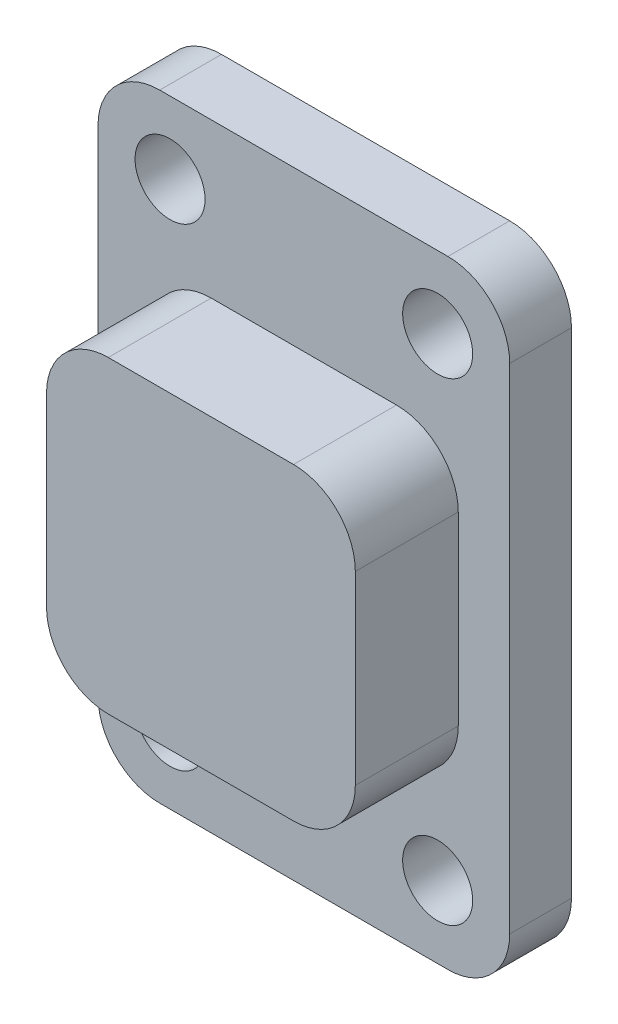
ISO-10303-21;
HEADER;
FILE_DESCRIPTION(('STEP AP214'),'2;1');
FILE_NAME('part.step','',(''),(''),'','','');
FILE_SCHEMA(('AUTOMOTIVE_DESIGN { 1 0 10303 214 1 1 1 1 }'));
ENDSEC;
DATA;
#1=APPLICATION_CONTEXT('core data for automotive mechanical design processes');
#2=APPLICATION_PROTOCOL_DEFINITION('international standard','automotive_design',2000,#1);
#3=PRODUCT_CONTEXT('',#1,'mechanical');
#4=PRODUCT('Part','Part','',(#3));
#5=PRODUCT_RELATED_PRODUCT_CATEGORY('part','',(#4));
#6=PRODUCT_DEFINITION_FORMATION('','',#4);
#7=PRODUCT_DEFINITION_CONTEXT('part definition',#1,'design');
#8=PRODUCT_DEFINITION('design','',#6,#7);
#9=PRODUCT_DEFINITION_SHAPE('','',#8);
#10=(LENGTH_UNIT() NAMED_UNIT(*) SI_UNIT(.MILLI.,.METRE.));
#11=(NAMED_UNIT(*) PLANE_ANGLE_UNIT() SI_UNIT($,.RADIAN.));
#12=(NAMED_UNIT(*) SI_UNIT($,.STERADIAN.) SOLID_ANGLE_UNIT());
#13=UNCERTAINTY_MEASURE_WITH_UNIT(LENGTH_MEASURE(1.E-05),#10,'distance_accuracy_value','');
#14=(GEOMETRIC_REPRESENTATION_CONTEXT(3) GLOBAL_UNCERTAINTY_ASSIGNED_CONTEXT((#13)) GLOBAL_UNIT_ASSIGNED_CONTEXT((#10,
#11,#12)) REPRESENTATION_CONTEXT('',''));
#15=CARTESIAN_POINT('',(0.,0.,0.));
#16=DIRECTION('',(0.,0.,1.));
#17=DIRECTION('',(1.,0.,0.));
#18=AXIS2_PLACEMENT_3D('',#15,#16,#17);
#19=CARTESIAN_POINT('',(0.,0.,3.));
#20=DIRECTION('',(0.,0.,-1.));
#21=DIRECTION('',(-1.,0.,0.));
#22=AXIS2_PLACEMENT_3D('',#19,#20,#21);
#23=PLANE('',#22);
#24=CARTESIAN_POINT('',(-6.5,11.5,3.));
#25=DIRECTION('',(0.,0.,1.));
#26=DIRECTION('',(1.,0.,0.));
#27=AXIS2_PLACEMENT_3D('',#24,#25,#26);
#28=CIRCLE('',#27,1.7);
#29=CARTESIAN_POINT('',(-4.8,11.5,3.));
#30=VERTEX_POINT('',#29);
#31=EDGE_CURVE('E284',#30,#30,#28,.T.);
#32=ORIENTED_EDGE('',*,*,#31,.F.);
#33=EDGE_LOOP('',(#32));
#34=FACE_BOUND('',#33,.T.);
#35=CARTESIAN_POINT('',(6.5,11.5,3.));
#36=DIRECTION('',(0.,0.,1.));
#37=DIRECTION('',(1.,0.,0.));
#38=AXIS2_PLACEMENT_3D('',#35,#36,#37);
#39=CIRCLE('',#38,1.7);
#40=CARTESIAN_POINT('',(8.2,11.5,3.));
#41=VERTEX_POINT('',#40);
#42=EDGE_CURVE('E290',#41,#41,#39,.T.);
#43=ORIENTED_EDGE('',*,*,#42,.F.);
#44=EDGE_LOOP('',(#43));
#45=FACE_BOUND('',#44,.T.);
#46=CARTESIAN_POINT('',(6.5,-11.5,3.));
#47=DIRECTION('',(0.,0.,1.));
#48=DIRECTION('',(1.,0.,0.));
#49=AXIS2_PLACEMENT_3D('',#46,#47,#48);
#50=CIRCLE('',#49,1.7);
#51=CARTESIAN_POINT('',(8.2,-11.5,3.));
#52=VERTEX_POINT('',#51);
#53=EDGE_CURVE('E296',#52,#52,#50,.T.);
#54=ORIENTED_EDGE('',*,*,#53,.F.);
#55=EDGE_LOOP('',(#54));
#56=FACE_BOUND('',#55,.T.);
#57=DIRECTION('',(0.,-1.,0.));
#58=VECTOR('',#57,1.);
#59=CARTESIAN_POINT('',(-10.,-15.,3.));
#60=LINE('',#59,#58);
#61=CARTESIAN_POINT('',(-10.,12.,3.));
#62=VERTEX_POINT('',#61);
#63=CARTESIAN_POINT('',(-10.,-12.,3.));
#64=VERTEX_POINT('',#63);
#65=EDGE_CURVE('E311',#62,#64,#60,.T.);
#66=ORIENTED_EDGE('',*,*,#65,.T.);
#67=CARTESIAN_POINT('',(-7.,-12.,3.));
#68=DIRECTION('',(0.,0.,-1.));
#69=DIRECTION('',(-1.,0.,0.));
#70=AXIS2_PLACEMENT_3D('',#67,#68,#69);
#71=CIRCLE('',#70,3.);
#72=CARTESIAN_POINT('',(-7.,-15.,3.));
#73=VERTEX_POINT('',#72);
#74=EDGE_CURVE('E198',#64,#73,#71,.F.);
#75=ORIENTED_EDGE('',*,*,#74,.T.);
#76=DIRECTION('',(1.,0.,0.));
#77=VECTOR('',#76,1.);
#78=CARTESIAN_POINT('',(-10.,-15.,3.));
#79=LINE('',#78,#77);
#80=CARTESIAN_POINT('',(7.,-15.,3.));
#81=VERTEX_POINT('',#80);
#82=EDGE_CURVE('E167',#73,#81,#79,.T.);
#83=ORIENTED_EDGE('',*,*,#82,.T.);
#84=CARTESIAN_POINT('',(7.,-12.,3.));
#85=DIRECTION('',(0.,0.,-1.));
#86=DIRECTION('',(-1.,0.,0.));
#87=AXIS2_PLACEMENT_3D('',#84,#85,#86);
#88=CIRCLE('',#87,3.);
#89=CARTESIAN_POINT('',(10.,-12.,3.));
#90=VERTEX_POINT('',#89);
#91=EDGE_CURVE('E196',#81,#90,#88,.F.);
#92=ORIENTED_EDGE('',*,*,#91,.T.);
#93=DIRECTION('',(0.,1.,0.));
#94=VECTOR('',#93,1.);
#95=CARTESIAN_POINT('',(10.,-15.,3.));
#96=LINE('',#95,#94);
#97=CARTESIAN_POINT('',(10.,12.,3.));
#98=VERTEX_POINT('',#97);
#99=EDGE_CURVE('E174',#90,#98,#96,.T.);
#100=ORIENTED_EDGE('',*,*,#99,.T.);
#101=CARTESIAN_POINT('',(7.,12.,3.));
#102=DIRECTION('',(0.,0.,-1.));
#103=DIRECTION('',(-1.,0.,0.));
#104=AXIS2_PLACEMENT_3D('',#101,#102,#103);
#105=CIRCLE('',#104,3.);
#106=CARTESIAN_POINT('',(7.,15.,3.));
#107=VERTEX_POINT('',#106);
#108=EDGE_CURVE('E194',#98,#107,#105,.F.);
#109=ORIENTED_EDGE('',*,*,#108,.T.);
#110=DIRECTION('',(-1.,0.,0.));
#111=VECTOR('',#110,1.);
#112=CARTESIAN_POINT('',(-10.,15.,3.));
#113=LINE('',#112,#111);
#114=CARTESIAN_POINT('',(-7.,15.,3.));
#115=VERTEX_POINT('',#114);
#116=EDGE_CURVE('E178',#107,#115,#113,.T.);
#117=ORIENTED_EDGE('',*,*,#116,.T.);
#118=CARTESIAN_POINT('',(-7.,12.,3.));
#119=DIRECTION('',(0.,0.,-1.));
#120=DIRECTION('',(-1.,0.,0.));
#121=AXIS2_PLACEMENT_3D('',#118,#119,#120);
#122=CIRCLE('',#121,3.);
#123=EDGE_CURVE('E192',#115,#62,#122,.F.);
#124=ORIENTED_EDGE('',*,*,#123,.T.);
#125=EDGE_LOOP('',(#66,#75,#83,#92,#100,#109,#117,#124));
#126=FACE_BOUND('',#125,.T.);
#127=CARTESIAN_POINT('',(-6.5,-11.5,3.));
#128=DIRECTION('',(0.,0.,1.));
#129=DIRECTION('',(1.,0.,0.));
#130=AXIS2_PLACEMENT_3D('',#127,#128,#129);
#131=CIRCLE('',#130,1.7);
#132=CARTESIAN_POINT('',(-4.8,-11.5,3.));
#133=VERTEX_POINT('',#132);
#134=EDGE_CURVE('E302',#133,#133,#131,.T.);
#135=ORIENTED_EDGE('',*,*,#134,.F.);
#136=EDGE_LOOP('',(#135));
#137=FACE_BOUND('',#136,.T.);
#138=DIRECTION('',(-1.,0.,0.));
#139=VECTOR('',#138,1.);
#140=CARTESIAN_POINT('',(7.5,7.5,3.));
#141=LINE('',#140,#139);
#142=CARTESIAN_POINT('',(4.5,7.5,3.));
#143=VERTEX_POINT('',#142);
#144=CARTESIAN_POINT('',(-4.5,7.5,3.));
#145=VERTEX_POINT('',#144);
#146=EDGE_CURVE('E242',#143,#145,#141,.T.);
#147=ORIENTED_EDGE('',*,*,#146,.F.);
#148=CARTESIAN_POINT('',(4.5,4.5,3.));
#149=DIRECTION('',(0.,0.,-1.));
#150=DIRECTION('',(-1.,0.,0.));
#151=AXIS2_PLACEMENT_3D('',#148,#149,#150);
#152=CIRCLE('',#151,3.);
#153=CARTESIAN_POINT('',(7.5,4.5,3.));
#154=VERTEX_POINT('',#153);
#155=EDGE_CURVE('E239',#143,#154,#152,.T.);
#156=ORIENTED_EDGE('',*,*,#155,.T.);
#157=DIRECTION('',(0.,1.,0.));
#158=VECTOR('',#157,1.);
#159=CARTESIAN_POINT('',(7.5,-7.5,3.));
#160=LINE('',#159,#158);
#161=CARTESIAN_POINT('',(7.5,-4.5,3.));
#162=VERTEX_POINT('',#161);
#163=EDGE_CURVE('E250',#162,#154,#160,.T.);
#164=ORIENTED_EDGE('',*,*,#163,.F.);
#165=CARTESIAN_POINT('',(4.5,-4.5,3.));
#166=DIRECTION('',(0.,0.,-1.));
#167=DIRECTION('',(-1.,0.,0.));
#168=AXIS2_PLACEMENT_3D('',#165,#166,#167);
#169=CIRCLE('',#168,3.);
#170=CARTESIAN_POINT('',(4.5,-7.5,3.));
#171=VERTEX_POINT('',#170);
#172=EDGE_CURVE('E237',#162,#171,#169,.T.);
#173=ORIENTED_EDGE('',*,*,#172,.T.);
#174=DIRECTION('',(1.,0.,0.));
#175=VECTOR('',#174,1.);
#176=CARTESIAN_POINT('',(7.5,-7.5,3.));
#177=LINE('',#176,#175);
#178=CARTESIAN_POINT('',(-4.5,-7.5,3.));
#179=VERTEX_POINT('',#178);
#180=EDGE_CURVE('E276',#179,#171,#177,.T.);
#181=ORIENTED_EDGE('',*,*,#180,.F.);
#182=CARTESIAN_POINT('',(-4.5,-4.5,3.));
#183=DIRECTION('',(0.,0.,-1.));
#184=DIRECTION('',(-1.,0.,0.));
#185=AXIS2_PLACEMENT_3D('',#182,#183,#184);
#186=CIRCLE('',#185,3.);
#187=CARTESIAN_POINT('',(-7.5,-4.5,3.));
#188=VERTEX_POINT('',#187);
#189=EDGE_CURVE('E12',#179,#188,#186,.T.);
#190=ORIENTED_EDGE('',*,*,#189,.T.);
#191=DIRECTION('',(0.,-1.,0.));
#192=VECTOR('',#191,1.);
#193=CARTESIAN_POINT('',(-7.5,-7.5,3.));
#194=LINE('',#193,#192);
#195=CARTESIAN_POINT('',(-7.5,4.5,3.));
#196=VERTEX_POINT('',#195);
#197=EDGE_CURVE('E243',#196,#188,#194,.T.);
#198=ORIENTED_EDGE('',*,*,#197,.F.);
#199=CARTESIAN_POINT('',(-4.5,4.5,3.));
#200=DIRECTION('',(0.,0.,-1.));
#201=DIRECTION('',(-1.,0.,0.));
#202=AXIS2_PLACEMENT_3D('',#199,#200,#201);
#203=CIRCLE('',#202,3.);
#204=EDGE_CURVE('E43',#196,#145,#203,.T.);
#205=ORIENTED_EDGE('',*,*,#204,.T.);
#206=EDGE_LOOP('',(#147,#156,#164,#173,#181,#190,#198,#205));
#207=FACE_BOUND('',#206,.T.);
#208=ADVANCED_FACE('F35',(#34,#45,#56,#126,#137,#207),#23,.F.);
#209=CARTESIAN_POINT('',(0.,0.,0.));
#210=DIRECTION('',(0.,0.,-1.));
#211=DIRECTION('',(-1.,0.,0.));
#212=AXIS2_PLACEMENT_3D('',#209,#210,#211);
#213=PLANE('',#212);
#214=CARTESIAN_POINT('',(-6.5,11.5,0.));
#215=DIRECTION('',(0.,0.,1.));
#216=DIRECTION('',(1.,0.,0.));
#217=AXIS2_PLACEMENT_3D('',#214,#215,#216);
#218=CIRCLE('',#217,1.7);
#219=CARTESIAN_POINT('',(-4.8,11.5,0.));
#220=VERTEX_POINT('',#219);
#221=EDGE_CURVE('E287',#220,#220,#218,.T.);
#222=ORIENTED_EDGE('',*,*,#221,.T.);
#223=EDGE_LOOP('',(#222));
#224=FACE_BOUND('',#223,.T.);
#225=CARTESIAN_POINT('',(6.5,11.5,0.));
#226=DIRECTION('',(0.,0.,1.));
#227=DIRECTION('',(1.,0.,0.));
#228=AXIS2_PLACEMENT_3D('',#225,#226,#227);
#229=CIRCLE('',#228,1.7);
#230=CARTESIAN_POINT('',(8.2,11.5,0.));
#231=VERTEX_POINT('',#230);
#232=EDGE_CURVE('E293',#231,#231,#229,.T.);
#233=ORIENTED_EDGE('',*,*,#232,.T.);
#234=EDGE_LOOP('',(#233));
#235=FACE_BOUND('',#234,.T.);
#236=CARTESIAN_POINT('',(6.5,-11.5,0.));
#237=DIRECTION('',(0.,0.,1.));
#238=DIRECTION('',(1.,0.,0.));
#239=AXIS2_PLACEMENT_3D('',#236,#237,#238);
#240=CIRCLE('',#239,1.7);
#241=CARTESIAN_POINT('',(8.2,-11.5,0.));
#242=VERTEX_POINT('',#241);
#243=EDGE_CURVE('E299',#242,#242,#240,.T.);
#244=ORIENTED_EDGE('',*,*,#243,.T.);
#245=EDGE_LOOP('',(#244));
#246=FACE_BOUND('',#245,.T.);
#247=DIRECTION('',(1.,0.,0.));
#248=VECTOR('',#247,1.);
#249=CARTESIAN_POINT('',(-10.,-15.,0.));
#250=LINE('',#249,#248);
#251=CARTESIAN_POINT('',(-7.,-15.,0.));
#252=VERTEX_POINT('',#251);
#253=CARTESIAN_POINT('',(7.,-15.,0.));
#254=VERTEX_POINT('',#253);
#255=EDGE_CURVE('E164',#252,#254,#250,.T.);
#256=ORIENTED_EDGE('',*,*,#255,.F.);
#257=CARTESIAN_POINT('',(-7.,-12.,0.));
#258=DIRECTION('',(0.,0.,-1.));
#259=DIRECTION('',(-1.,0.,0.));
#260=AXIS2_PLACEMENT_3D('',#257,#258,#259);
#261=CIRCLE('',#260,3.);
#262=CARTESIAN_POINT('',(-10.,-12.,0.));
#263=VERTEX_POINT('',#262);
#264=EDGE_CURVE('E147',#252,#263,#261,.T.);
#265=ORIENTED_EDGE('',*,*,#264,.T.);
#266=DIRECTION('',(0.,-1.,0.));
#267=VECTOR('',#266,1.);
#268=CARTESIAN_POINT('',(-10.,-15.,0.));
#269=LINE('',#268,#267);
#270=CARTESIAN_POINT('',(-10.,12.,0.));
#271=VERTEX_POINT('',#270);
#272=EDGE_CURVE('E175',#271,#263,#269,.T.);
#273=ORIENTED_EDGE('',*,*,#272,.F.);
#274=CARTESIAN_POINT('',(-7.,12.,0.));
#275=DIRECTION('',(0.,0.,-1.));
#276=DIRECTION('',(-1.,0.,0.));
#277=AXIS2_PLACEMENT_3D('',#274,#275,#276);
#278=CIRCLE('',#277,3.);
#279=CARTESIAN_POINT('',(-7.,15.,0.));
#280=VERTEX_POINT('',#279);
#281=EDGE_CURVE('E168',#271,#280,#278,.T.);
#282=ORIENTED_EDGE('',*,*,#281,.T.);
#283=DIRECTION('',(-1.,0.,0.));
#284=VECTOR('',#283,1.);
#285=CARTESIAN_POINT('',(-10.,15.,0.));
#286=LINE('',#285,#284);
#287=CARTESIAN_POINT('',(7.,15.,0.));
#288=VERTEX_POINT('',#287);
#289=EDGE_CURVE('E180',#288,#280,#286,.T.);
#290=ORIENTED_EDGE('',*,*,#289,.F.);
#291=CARTESIAN_POINT('',(7.,12.,0.));
#292=DIRECTION('',(0.,0.,-1.));
#293=DIRECTION('',(-1.,0.,0.));
#294=AXIS2_PLACEMENT_3D('',#291,#292,#293);
#295=CIRCLE('',#294,3.);
#296=CARTESIAN_POINT('',(10.,12.,0.));
#297=VERTEX_POINT('',#296);
#298=EDGE_CURVE('E186',#288,#297,#295,.T.);
#299=ORIENTED_EDGE('',*,*,#298,.T.);
#300=DIRECTION('',(0.,1.,0.));
#301=VECTOR('',#300,1.);
#302=CARTESIAN_POINT('',(10.,-15.,0.));
#303=LINE('',#302,#301);
#304=CARTESIAN_POINT('',(10.,-12.,0.));
#305=VERTEX_POINT('',#304);
#306=EDGE_CURVE('E307',#305,#297,#303,.T.);
#307=ORIENTED_EDGE('',*,*,#306,.F.);
#308=CARTESIAN_POINT('',(7.,-12.,0.));
#309=DIRECTION('',(0.,0.,-1.));
#310=DIRECTION('',(-1.,0.,0.));
#311=AXIS2_PLACEMENT_3D('',#308,#309,#310);
#312=CIRCLE('',#311,3.);
#313=EDGE_CURVE('E158',#305,#254,#312,.T.);
#314=ORIENTED_EDGE('',*,*,#313,.T.);
#315=EDGE_LOOP('',(#256,#265,#273,#282,#290,#299,#307,#314));
#316=FACE_BOUND('',#315,.T.);
#317=CARTESIAN_POINT('',(-6.5,-11.5,0.));
#318=DIRECTION('',(0.,0.,1.));
#319=DIRECTION('',(1.,0.,0.));
#320=AXIS2_PLACEMENT_3D('',#317,#318,#319);
#321=CIRCLE('',#320,1.7);
#322=CARTESIAN_POINT('',(-4.8,-11.5,0.));
#323=VERTEX_POINT('',#322);
#324=EDGE_CURVE('E305',#323,#323,#321,.T.);
#325=ORIENTED_EDGE('',*,*,#324,.T.);
#326=EDGE_LOOP('',(#325));
#327=FACE_BOUND('',#326,.T.);
#328=CARTESIAN_POINT('',(0.,0.,0.));
#329=DIRECTION('',(0.,0.,-1.));
#330=DIRECTION('',(-1.,0.,0.));
#331=AXIS2_PLACEMENT_3D('',#328,#329,#330);
#332=CIRCLE('',#331,2.75);
#333=CARTESIAN_POINT('',(-2.75,0.,0.));
#334=VERTEX_POINT('',#333);
#335=EDGE_CURVE('E264',#334,#334,#332,.T.);
#336=ORIENTED_EDGE('',*,*,#335,.F.);
#337=EDGE_LOOP('',(#336));
#338=FACE_BOUND('',#337,.T.);
#339=ADVANCED_FACE('F171',(#224,#235,#246,#316,#327,#338),#213,.T.);
#340=CARTESIAN_POINT('',(10.,-15.,3.));
#341=DIRECTION('',(-1.,0.,0.));
#342=DIRECTION('',(0.,0.,1.));
#343=AXIS2_PLACEMENT_3D('',#340,#341,#342);
#344=PLANE('',#343);
#345=ORIENTED_EDGE('',*,*,#99,.F.);
#346=DIRECTION('',(0.,0.,-1.));
#347=VECTOR('',#346,1.);
#348=CARTESIAN_POINT('',(10.,-12.,3.));
#349=LINE('',#348,#347);
#350=EDGE_CURVE('E202',#90,#305,#349,.T.);
#351=ORIENTED_EDGE('',*,*,#350,.T.);
#352=ORIENTED_EDGE('',*,*,#306,.T.);
#353=DIRECTION('',(0.,0.,-1.));
#354=VECTOR('',#353,1.);
#355=CARTESIAN_POINT('',(10.,12.,3.));
#356=LINE('',#355,#354);
#357=EDGE_CURVE('E200',#297,#98,#356,.F.);
#358=ORIENTED_EDGE('',*,*,#357,.T.);
#359=EDGE_LOOP('',(#345,#351,#352,#358));
#360=FACE_BOUND('',#359,.T.);
#361=ADVANCED_FACE('F340',(#360),#344,.F.);
#362=CARTESIAN_POINT('',(-10.,15.,3.));
#363=DIRECTION('',(0.,-1.,0.));
#364=DIRECTION('',(0.,0.,-1.));
#365=AXIS2_PLACEMENT_3D('',#362,#363,#364);
#366=PLANE('',#365);
#367=ORIENTED_EDGE('',*,*,#116,.F.);
#368=DIRECTION('',(0.,0.,-1.));
#369=VECTOR('',#368,1.);
#370=CARTESIAN_POINT('',(7.,15.,3.));
#371=LINE('',#370,#369);
#372=EDGE_CURVE('E207',#107,#288,#371,.T.);
#373=ORIENTED_EDGE('',*,*,#372,.T.);
#374=ORIENTED_EDGE('',*,*,#289,.T.);
#375=DIRECTION('',(0.,0.,-1.));
#376=VECTOR('',#375,1.);
#377=CARTESIAN_POINT('',(-7.,15.,3.));
#378=LINE('',#377,#376);
#379=EDGE_CURVE('E205',#280,#115,#378,.F.);
#380=ORIENTED_EDGE('',*,*,#379,.T.);
#381=EDGE_LOOP('',(#367,#373,#374,#380));
#382=FACE_BOUND('',#381,.T.);
#383=ADVANCED_FACE('F321',(#382),#366,.F.);
#384=CARTESIAN_POINT('',(-10.,-15.,3.));
#385=DIRECTION('',(1.,0.,0.));
#386=DIRECTION('',(0.,0.,-1.));
#387=AXIS2_PLACEMENT_3D('',#384,#385,#386);
#388=PLANE('',#387);
#389=ORIENTED_EDGE('',*,*,#272,.T.);
#390=DIRECTION('',(0.,0.,-1.));
#391=VECTOR('',#390,1.);
#392=CARTESIAN_POINT('',(-10.,-12.,3.));
#393=LINE('',#392,#391);
#394=EDGE_CURVE('E152',#263,#64,#393,.F.);
#395=ORIENTED_EDGE('',*,*,#394,.T.);
#396=ORIENTED_EDGE('',*,*,#65,.F.);
#397=DIRECTION('',(0.,0.,-1.));
#398=VECTOR('',#397,1.);
#399=CARTESIAN_POINT('',(-10.,12.,3.));
#400=LINE('',#399,#398);
#401=EDGE_CURVE('E157',#62,#271,#400,.T.);
#402=ORIENTED_EDGE('',*,*,#401,.T.);
#403=EDGE_LOOP('',(#389,#395,#396,#402));
#404=FACE_BOUND('',#403,.T.);
#405=ADVANCED_FACE('F331',(#404),#388,.F.);
#406=CARTESIAN_POINT('',(-10.,-15.,3.));
#407=DIRECTION('',(0.,1.,0.));
#408=DIRECTION('',(0.,0.,1.));
#409=AXIS2_PLACEMENT_3D('',#406,#407,#408);
#410=PLANE('',#409);
#411=ORIENTED_EDGE('',*,*,#82,.F.);
#412=DIRECTION('',(0.,0.,-1.));
#413=VECTOR('',#412,1.);
#414=CARTESIAN_POINT('',(-7.,-15.,3.));
#415=LINE('',#414,#413);
#416=EDGE_CURVE('E151',#73,#252,#415,.T.);
#417=ORIENTED_EDGE('',*,*,#416,.T.);
#418=ORIENTED_EDGE('',*,*,#255,.T.);
#419=DIRECTION('',(0.,0.,-1.));
#420=VECTOR('',#419,1.);
#421=CARTESIAN_POINT('',(7.,-15.,3.));
#422=LINE('',#421,#420);
#423=EDGE_CURVE('E169',#254,#81,#422,.F.);
#424=ORIENTED_EDGE('',*,*,#423,.T.);
#425=EDGE_LOOP('',(#411,#417,#418,#424));
#426=FACE_BOUND('',#425,.T.);
#427=ADVANCED_FACE('F163',(#426),#410,.F.);
#428=CARTESIAN_POINT('',(-6.5,-11.5,3.));
#429=DIRECTION('',(0.,0.,1.));
#430=DIRECTION('',(1.,0.,0.));
#431=AXIS2_PLACEMENT_3D('',#428,#429,#430);
#432=CYLINDRICAL_SURFACE('',#431,1.7);
#433=ORIENTED_EDGE('',*,*,#324,.F.);
#434=EDGE_LOOP('',(#433));
#435=FACE_BOUND('',#434,.T.);
#436=ORIENTED_EDGE('',*,*,#134,.T.);
#437=EDGE_LOOP('',(#436));
#438=FACE_BOUND('',#437,.T.);
#439=ADVANCED_FACE('F338',(#435,#438),#432,.F.);
#440=CARTESIAN_POINT('',(6.5,-11.5,3.));
#441=DIRECTION('',(0.,0.,1.));
#442=DIRECTION('',(1.,0.,0.));
#443=AXIS2_PLACEMENT_3D('',#440,#441,#442);
#444=CYLINDRICAL_SURFACE('',#443,1.7);
#445=ORIENTED_EDGE('',*,*,#243,.F.);
#446=EDGE_LOOP('',(#445));
#447=FACE_BOUND('',#446,.T.);
#448=ORIENTED_EDGE('',*,*,#53,.T.);
#449=EDGE_LOOP('',(#448));
#450=FACE_BOUND('',#449,.T.);
#451=ADVANCED_FACE('F355',(#447,#450),#444,.F.);
#452=CARTESIAN_POINT('',(6.5,11.5,3.));
#453=DIRECTION('',(0.,0.,1.));
#454=DIRECTION('',(1.,0.,0.));
#455=AXIS2_PLACEMENT_3D('',#452,#453,#454);
#456=CYLINDRICAL_SURFACE('',#455,1.7);
#457=ORIENTED_EDGE('',*,*,#232,.F.);
#458=EDGE_LOOP('',(#457));
#459=FACE_BOUND('',#458,.T.);
#460=ORIENTED_EDGE('',*,*,#42,.T.);
#461=EDGE_LOOP('',(#460));
#462=FACE_BOUND('',#461,.T.);
#463=ADVANCED_FACE('F359',(#459,#462),#456,.F.);
#464=CARTESIAN_POINT('',(-6.5,11.5,3.));
#465=DIRECTION('',(0.,0.,1.));
#466=DIRECTION('',(1.,0.,0.));
#467=AXIS2_PLACEMENT_3D('',#464,#465,#466);
#468=CYLINDRICAL_SURFACE('',#467,1.7);
#469=ORIENTED_EDGE('',*,*,#221,.F.);
#470=EDGE_LOOP('',(#469));
#471=FACE_BOUND('',#470,.T.);
#472=ORIENTED_EDGE('',*,*,#31,.T.);
#473=EDGE_LOOP('',(#472));
#474=FACE_BOUND('',#473,.T.);
#475=ADVANCED_FACE('F363',(#471,#474),#468,.F.);
#476=CARTESIAN_POINT('',(-7.,-12.,3.));
#477=DIRECTION('',(0.,0.,-1.));
#478=DIRECTION('',(-1.,0.,0.));
#479=AXIS2_PLACEMENT_3D('',#476,#477,#478);
#480=CYLINDRICAL_SURFACE('',#479,3.);
#481=ORIENTED_EDGE('',*,*,#74,.F.);
#482=ORIENTED_EDGE('',*,*,#394,.F.);
#483=ORIENTED_EDGE('',*,*,#264,.F.);
#484=ORIENTED_EDGE('',*,*,#416,.F.);
#485=EDGE_LOOP('',(#481,#482,#483,#484));
#486=FACE_BOUND('',#485,.T.);
#487=ADVANCED_FACE('F150',(#486),#480,.T.);
#488=CARTESIAN_POINT('',(7.,-12.,3.));
#489=DIRECTION('',(0.,0.,-1.));
#490=DIRECTION('',(-1.,0.,0.));
#491=AXIS2_PLACEMENT_3D('',#488,#489,#490);
#492=CYLINDRICAL_SURFACE('',#491,3.);
#493=ORIENTED_EDGE('',*,*,#91,.F.);
#494=ORIENTED_EDGE('',*,*,#423,.F.);
#495=ORIENTED_EDGE('',*,*,#313,.F.);
#496=ORIENTED_EDGE('',*,*,#350,.F.);
#497=EDGE_LOOP('',(#493,#494,#495,#496));
#498=FACE_BOUND('',#497,.T.);
#499=ADVANCED_FACE('F498',(#498),#492,.T.);
#500=CARTESIAN_POINT('',(7.,12.,3.));
#501=DIRECTION('',(0.,0.,-1.));
#502=DIRECTION('',(-1.,0.,0.));
#503=AXIS2_PLACEMENT_3D('',#500,#501,#502);
#504=CYLINDRICAL_SURFACE('',#503,3.);
#505=ORIENTED_EDGE('',*,*,#108,.F.);
#506=ORIENTED_EDGE('',*,*,#357,.F.);
#507=ORIENTED_EDGE('',*,*,#298,.F.);
#508=ORIENTED_EDGE('',*,*,#372,.F.);
#509=EDGE_LOOP('',(#505,#506,#507,#508));
#510=FACE_BOUND('',#509,.T.);
#511=ADVANCED_FACE('F489',(#510),#504,.T.);
#512=CARTESIAN_POINT('',(-7.,12.,3.));
#513=DIRECTION('',(0.,0.,-1.));
#514=DIRECTION('',(-1.,0.,0.));
#515=AXIS2_PLACEMENT_3D('',#512,#513,#514);
#516=CYLINDRICAL_SURFACE('',#515,3.);
#517=ORIENTED_EDGE('',*,*,#123,.F.);
#518=ORIENTED_EDGE('',*,*,#379,.F.);
#519=ORIENTED_EDGE('',*,*,#281,.F.);
#520=ORIENTED_EDGE('',*,*,#401,.F.);
#521=EDGE_LOOP('',(#517,#518,#519,#520));
#522=FACE_BOUND('',#521,.T.);
#523=ADVANCED_FACE('F325',(#522),#516,.T.);
#524=CARTESIAN_POINT('',(0.,0.,10.116652224137));
#525=DIRECTION('',(0.,0.,-1.));
#526=DIRECTION('',(-1.,0.,0.));
#527=AXIS2_PLACEMENT_3D('',#524,#525,#526);
#528=CYLINDRICAL_SURFACE('',#527,2.75);
#529=CARTESIAN_POINT('',(0.,0.,0.5));
#530=DIRECTION('',(0.,0.,-1.));
#531=DIRECTION('',(-1.,0.,0.));
#532=AXIS2_PLACEMENT_3D('',#529,#530,#531);
#533=CIRCLE('',#532,2.75);
#534=CARTESIAN_POINT('',(-2.75,0.,0.5));
#535=VERTEX_POINT('',#534);
#536=EDGE_CURVE('E268',#535,#535,#533,.F.);
#537=ORIENTED_EDGE('',*,*,#536,.T.);
#538=EDGE_LOOP('',(#537));
#539=FACE_BOUND('',#538,.T.);
#540=ORIENTED_EDGE('',*,*,#335,.T.);
#541=EDGE_LOOP('',(#540));
#542=FACE_BOUND('',#541,.T.);
#543=ADVANCED_FACE('F371',(#539,#542),#528,.F.);
#544=CARTESIAN_POINT('',(0.,0.,0.5));
#545=DIRECTION('',(0.,0.,-1.));
#546=DIRECTION('',(-1.,0.,0.));
#547=AXIS2_PLACEMENT_3D('',#544,#545,#546);
#548=PLANE('',#547);
#549=ORIENTED_EDGE('',*,*,#536,.F.);
#550=EDGE_LOOP('',(#549));
#551=FACE_BOUND('',#550,.T.);
#552=ADVANCED_FACE('F368',(#551),#548,.T.);
#553=CARTESIAN_POINT('',(7.5,7.5,29.2132034355964));
#554=DIRECTION('',(0.,-1.,0.));
#555=DIRECTION('',(1.,0.,0.));
#556=AXIS2_PLACEMENT_3D('',#553,#554,#555);
#557=PLANE('',#556);
#558=DIRECTION('',(1.,0.,0.));
#559=VECTOR('',#558,1.);
#560=CARTESIAN_POINT('',(7.5,7.5,8.));
#561=LINE('',#560,#559);
#562=CARTESIAN_POINT('',(-4.5,7.5,8.));
#563=VERTEX_POINT('',#562);
#564=CARTESIAN_POINT('',(4.5,7.5,8.));
#565=VERTEX_POINT('',#564);
#566=EDGE_CURVE('E249',#563,#565,#561,.T.);
#567=ORIENTED_EDGE('',*,*,#566,.T.);
#568=DIRECTION('',(0.,0.,-1.));
#569=VECTOR('',#568,1.);
#570=CARTESIAN_POINT('',(4.5,7.5,29.2132034355964));
#571=LINE('',#570,#569);
#572=EDGE_CURVE('E230',#565,#143,#571,.T.);
#573=ORIENTED_EDGE('',*,*,#572,.T.);
#574=ORIENTED_EDGE('',*,*,#146,.T.);
#575=DIRECTION('',(0.,0.,-1.));
#576=VECTOR('',#575,1.);
#577=CARTESIAN_POINT('',(-4.5,7.5,29.2132034355964));
#578=LINE('',#577,#576);
#579=EDGE_CURVE('E228',#145,#563,#578,.F.);
#580=ORIENTED_EDGE('',*,*,#579,.T.);
#581=EDGE_LOOP('',(#567,#573,#574,#580));
#582=FACE_BOUND('',#581,.T.);
#583=ADVANCED_FACE('F246',(#582),#557,.F.);
#584=CARTESIAN_POINT('',(7.5,-7.5,29.2132034355964));
#585=DIRECTION('',(-1.,0.,0.));
#586=DIRECTION('',(0.,0.,1.));
#587=AXIS2_PLACEMENT_3D('',#584,#585,#586);
#588=PLANE('',#587);
#589=DIRECTION('',(0.,-1.,0.));
#590=VECTOR('',#589,1.);
#591=CARTESIAN_POINT('',(7.5,-7.5,8.));
#592=LINE('',#591,#590);
#593=CARTESIAN_POINT('',(7.5,4.5,8.));
#594=VERTEX_POINT('',#593);
#595=CARTESIAN_POINT('',(7.5,-4.5,8.));
#596=VERTEX_POINT('',#595);
#597=EDGE_CURVE('E271',#594,#596,#592,.T.);
#598=ORIENTED_EDGE('',*,*,#597,.T.);
#599=DIRECTION('',(0.,0.,-1.));
#600=VECTOR('',#599,1.);
#601=CARTESIAN_POINT('',(7.5,-4.5,29.2132034355964));
#602=LINE('',#601,#600);
#603=EDGE_CURVE('E212',#596,#162,#602,.T.);
#604=ORIENTED_EDGE('',*,*,#603,.T.);
#605=ORIENTED_EDGE('',*,*,#163,.T.);
#606=DIRECTION('',(0.,0.,-1.));
#607=VECTOR('',#606,1.);
#608=CARTESIAN_POINT('',(7.5,4.5,29.2132034355964));
#609=LINE('',#608,#607);
#610=EDGE_CURVE('E210',#154,#594,#609,.F.);
#611=ORIENTED_EDGE('',*,*,#610,.T.);
#612=EDGE_LOOP('',(#598,#604,#605,#611));
#613=FACE_BOUND('',#612,.T.);
#614=ADVANCED_FACE('F384',(#613),#588,.F.);
#615=CARTESIAN_POINT('',(7.5,-7.5,29.2132034355964));
#616=DIRECTION('',(0.,1.,0.));
#617=DIRECTION('',(-1.,0.,0.));
#618=AXIS2_PLACEMENT_3D('',#615,#616,#617);
#619=PLANE('',#618);
#620=ORIENTED_EDGE('',*,*,#180,.T.);
#621=DIRECTION('',(0.,0.,-1.));
#622=VECTOR('',#621,1.);
#623=CARTESIAN_POINT('',(4.5,-7.5,29.2132034355964));
#624=LINE('',#623,#622);
#625=CARTESIAN_POINT('',(4.5,-7.5,8.));
#626=VERTEX_POINT('',#625);
#627=EDGE_CURVE('E218',#171,#626,#624,.F.);
#628=ORIENTED_EDGE('',*,*,#627,.T.);
#629=DIRECTION('',(-1.,0.,0.));
#630=VECTOR('',#629,1.);
#631=CARTESIAN_POINT('',(7.5,-7.5,8.));
#632=LINE('',#631,#630);
#633=CARTESIAN_POINT('',(-4.5,-7.5,8.));
#634=VERTEX_POINT('',#633);
#635=EDGE_CURVE('E265',#626,#634,#632,.T.);
#636=ORIENTED_EDGE('',*,*,#635,.T.);
#637=DIRECTION('',(0.,0.,-1.));
#638=VECTOR('',#637,1.);
#639=CARTESIAN_POINT('',(-4.5,-7.5,29.2132034355964));
#640=LINE('',#639,#638);
#641=EDGE_CURVE('E215',#634,#179,#640,.T.);
#642=ORIENTED_EDGE('',*,*,#641,.T.);
#643=EDGE_LOOP('',(#620,#628,#636,#642));
#644=FACE_BOUND('',#643,.T.);
#645=ADVANCED_FACE('F381',(#644),#619,.F.);
#646=CARTESIAN_POINT('',(-7.5,-7.5,29.2132034355964));
#647=DIRECTION('',(1.,0.,0.));
#648=DIRECTION('',(0.,0.,-1.));
#649=AXIS2_PLACEMENT_3D('',#646,#647,#648);
#650=PLANE('',#649);
#651=DIRECTION('',(0.,1.,0.));
#652=VECTOR('',#651,1.);
#653=CARTESIAN_POINT('',(-7.5,-7.5,8.));
#654=LINE('',#653,#652);
#655=CARTESIAN_POINT('',(-7.5,-4.5,8.));
#656=VERTEX_POINT('',#655);
#657=CARTESIAN_POINT('',(-7.5,4.5,8.));
#658=VERTEX_POINT('',#657);
#659=EDGE_CURVE('E259',#656,#658,#654,.T.);
#660=ORIENTED_EDGE('',*,*,#659,.T.);
#661=DIRECTION('',(0.,0.,-1.));
#662=VECTOR('',#661,1.);
#663=CARTESIAN_POINT('',(-7.5,4.5,29.2132034355964));
#664=LINE('',#663,#662);
#665=EDGE_CURVE('E235',#658,#196,#664,.T.);
#666=ORIENTED_EDGE('',*,*,#665,.T.);
#667=ORIENTED_EDGE('',*,*,#197,.T.);
#668=DIRECTION('',(0.,0.,-1.));
#669=VECTOR('',#668,1.);
#670=CARTESIAN_POINT('',(-7.5,-4.5,29.2132034355964));
#671=LINE('',#670,#669);
#672=EDGE_CURVE('E233',#188,#656,#671,.F.);
#673=ORIENTED_EDGE('',*,*,#672,.T.);
#674=EDGE_LOOP('',(#660,#666,#667,#673));
#675=FACE_BOUND('',#674,.T.);
#676=ADVANCED_FACE('F262',(#675),#650,.F.);
#677=CARTESIAN_POINT('',(-10.,10.441731409545,8.));
#678=DIRECTION('',(0.,0.,-1.));
#679=DIRECTION('',(0.,1.,0.));
#680=AXIS2_PLACEMENT_3D('',#677,#678,#679);
#681=PLANE('',#680);
#682=ORIENTED_EDGE('',*,*,#635,.F.);
#683=CARTESIAN_POINT('',(4.5,-4.5,8.));
#684=DIRECTION('',(0.,0.,-1.));
#685=DIRECTION('',(0.,1.,0.));
#686=AXIS2_PLACEMENT_3D('',#683,#684,#685);
#687=CIRCLE('',#686,3.);
#688=EDGE_CURVE('E226',#626,#596,#687,.F.);
#689=ORIENTED_EDGE('',*,*,#688,.T.);
#690=ORIENTED_EDGE('',*,*,#597,.F.);
#691=CARTESIAN_POINT('',(4.5,4.5,8.));
#692=DIRECTION('',(0.,0.,-1.));
#693=DIRECTION('',(0.,1.,0.));
#694=AXIS2_PLACEMENT_3D('',#691,#692,#693);
#695=CIRCLE('',#694,3.);
#696=EDGE_CURVE('E224',#594,#565,#695,.F.);
#697=ORIENTED_EDGE('',*,*,#696,.T.);
#698=ORIENTED_EDGE('',*,*,#566,.F.);
#699=CARTESIAN_POINT('',(-4.5,4.5,8.));
#700=DIRECTION('',(0.,0.,-1.));
#701=DIRECTION('',(0.,1.,0.));
#702=AXIS2_PLACEMENT_3D('',#699,#700,#701);
#703=CIRCLE('',#702,3.);
#704=EDGE_CURVE('E222',#563,#658,#703,.F.);
#705=ORIENTED_EDGE('',*,*,#704,.T.);
#706=ORIENTED_EDGE('',*,*,#659,.F.);
#707=CARTESIAN_POINT('',(-4.5,-4.5,8.));
#708=DIRECTION('',(0.,0.,-1.));
#709=DIRECTION('',(0.,1.,0.));
#710=AXIS2_PLACEMENT_3D('',#707,#708,#709);
#711=CIRCLE('',#710,3.);
#712=EDGE_CURVE('E220',#656,#634,#711,.F.);
#713=ORIENTED_EDGE('',*,*,#712,.T.);
#714=EDGE_LOOP('',(#682,#689,#690,#697,#698,#705,#706,#713));
#715=FACE_BOUND('',#714,.T.);
#716=ADVANCED_FACE('F258',(#715),#681,.F.);
#717=CARTESIAN_POINT('',(4.5,-4.5,29.2132034355964));
#718=DIRECTION('',(0.,0.,-1.));
#719=DIRECTION('',(-1.,0.,0.));
#720=AXIS2_PLACEMENT_3D('',#717,#718,#719);
#721=CYLINDRICAL_SURFACE('',#720,3.);
#722=ORIENTED_EDGE('',*,*,#688,.F.);
#723=ORIENTED_EDGE('',*,*,#627,.F.);
#724=ORIENTED_EDGE('',*,*,#172,.F.);
#725=ORIENTED_EDGE('',*,*,#603,.F.);
#726=EDGE_LOOP('',(#722,#723,#724,#725));
#727=FACE_BOUND('',#726,.T.);
#728=ADVANCED_FACE('F375',(#727),#721,.T.);
#729=CARTESIAN_POINT('',(4.5,4.5,29.2132034355964));
#730=DIRECTION('',(0.,0.,-1.));
#731=DIRECTION('',(-1.,0.,0.));
#732=AXIS2_PLACEMENT_3D('',#729,#730,#731);
#733=CYLINDRICAL_SURFACE('',#732,3.);
#734=ORIENTED_EDGE('',*,*,#696,.F.);
#735=ORIENTED_EDGE('',*,*,#610,.F.);
#736=ORIENTED_EDGE('',*,*,#155,.F.);
#737=ORIENTED_EDGE('',*,*,#572,.F.);
#738=EDGE_LOOP('',(#734,#735,#736,#737));
#739=FACE_BOUND('',#738,.T.);
#740=ADVANCED_FACE('F416',(#739),#733,.T.);
#741=CARTESIAN_POINT('',(-4.5,4.5,29.2132034355964));
#742=DIRECTION('',(0.,0.,-1.));
#743=DIRECTION('',(-1.,0.,0.));
#744=AXIS2_PLACEMENT_3D('',#741,#742,#743);
#745=CYLINDRICAL_SURFACE('',#744,3.);
#746=ORIENTED_EDGE('',*,*,#704,.F.);
#747=ORIENTED_EDGE('',*,*,#579,.F.);
#748=ORIENTED_EDGE('',*,*,#204,.F.);
#749=ORIENTED_EDGE('',*,*,#665,.F.);
#750=EDGE_LOOP('',(#746,#747,#748,#749));
#751=FACE_BOUND('',#750,.T.);
#752=ADVANCED_FACE('F253',(#751),#745,.T.);
#753=CARTESIAN_POINT('',(-4.5,-4.5,29.2132034355964));
#754=DIRECTION('',(0.,0.,-1.));
#755=DIRECTION('',(-1.,0.,0.));
#756=AXIS2_PLACEMENT_3D('',#753,#754,#755);
#757=CYLINDRICAL_SURFACE('',#756,3.);
#758=ORIENTED_EDGE('',*,*,#712,.F.);
#759=ORIENTED_EDGE('',*,*,#672,.F.);
#760=ORIENTED_EDGE('',*,*,#189,.F.);
#761=ORIENTED_EDGE('',*,*,#641,.F.);
#762=EDGE_LOOP('',(#758,#759,#760,#761));
#763=FACE_BOUND('',#762,.T.);
#764=ADVANCED_FACE('F37',(#763),#757,.T.);
#765=CLOSED_SHELL('',(#208,#339,#361,#383,#405,#427,#439,#451,#463,#475,#487,#499,#511,#523,
#543,#552,#583,#614,#645,#676,#716,#728,#740,#752,#764));
#766=MANIFOLD_SOLID_BREP('B2',#765);
#767=ADVANCED_BREP_SHAPE_REPRESENTATION('',(#18,#766),#14);
#768=SHAPE_DEFINITION_REPRESENTATION(#9,#767);
ENDSEC;
END-ISO-10303-21;
